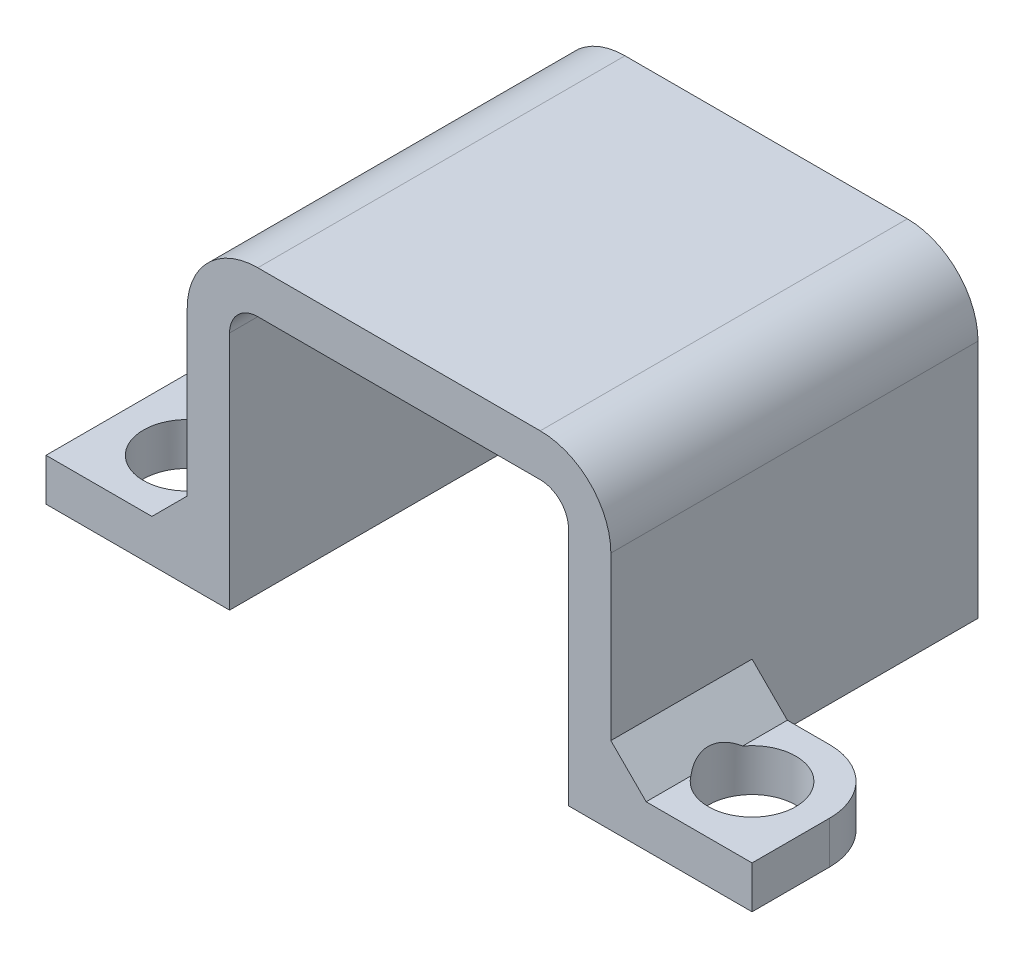
ISO-10303-21;
HEADER;
FILE_DESCRIPTION(('STEP AP214'),'2;1');
FILE_NAME('part.step','',(''),(''),'','','');
FILE_SCHEMA(('AUTOMOTIVE_DESIGN { 1 0 10303 214 1 1 1 1 }'));
ENDSEC;
DATA;
#1=APPLICATION_CONTEXT('core data for automotive mechanical design processes');
#2=APPLICATION_PROTOCOL_DEFINITION('international standard','automotive_design',2000,#1);
#3=PRODUCT_CONTEXT('',#1,'mechanical');
#4=PRODUCT('Part','Part','',(#3));
#5=PRODUCT_RELATED_PRODUCT_CATEGORY('part','',(#4));
#6=PRODUCT_DEFINITION_FORMATION('','',#4);
#7=PRODUCT_DEFINITION_CONTEXT('part definition',#1,'design');
#8=PRODUCT_DEFINITION('design','',#6,#7);
#9=PRODUCT_DEFINITION_SHAPE('','',#8);
#10=(LENGTH_UNIT() NAMED_UNIT(*) SI_UNIT(.MILLI.,.METRE.));
#11=(NAMED_UNIT(*) PLANE_ANGLE_UNIT() SI_UNIT($,.RADIAN.));
#12=(NAMED_UNIT(*) SI_UNIT($,.STERADIAN.) SOLID_ANGLE_UNIT());
#13=UNCERTAINTY_MEASURE_WITH_UNIT(LENGTH_MEASURE(1.E-05),#10,'distance_accuracy_value','');
#14=(GEOMETRIC_REPRESENTATION_CONTEXT(3) GLOBAL_UNCERTAINTY_ASSIGNED_CONTEXT((#13)) GLOBAL_UNIT_ASSIGNED_CONTEXT((#10,
#11,#12)) REPRESENTATION_CONTEXT('',''));
#15=CARTESIAN_POINT('',(0.,0.,0.));
#16=DIRECTION('',(0.,0.,1.));
#17=DIRECTION('',(1.,0.,0.));
#18=AXIS2_PLACEMENT_3D('',#15,#16,#17);
#19=CARTESIAN_POINT('',(-12.5,-8.,-13.));
#20=DIRECTION('',(0.,-1.,0.));
#21=DIRECTION('',(0.,0.,1.));
#22=AXIS2_PLACEMENT_3D('',#19,#20,#21);
#23=PLANE('',#22);
#24=CARTESIAN_POINT('',(-7.56801948466053,-8.,-10.75));
#25=DIRECTION('',(0.,1.,0.));
#26=DIRECTION('',(0.,0.,1.));
#27=AXIS2_PLACEMENT_3D('',#24,#25,#26);
#28=CIRCLE('',#27,2.25);
#29=CARTESIAN_POINT('',(-9.15900974233026,-8.,-12.3409902576697));
#30=VERTEX_POINT('',#29);
#31=CARTESIAN_POINT('',(-8.75000000000001,-8.,-12.6645292009676));
#32=VERTEX_POINT('',#31);
#33=EDGE_CURVE('E358',#30,#32,#28,.F.);
#34=ORIENTED_EDGE('',*,*,#33,.F.);
#35=DIRECTION('',(0.707106781186546,0.,-0.707106781186549));
#36=VECTOR('',#35,1.);
#37=CARTESIAN_POINT('',(-8.5,-8.,-13.));
#38=LINE('',#37,#36);
#39=CARTESIAN_POINT('',(-11.8409902576697,-8.,-9.65900974233025));
#40=VERTEX_POINT('',#39);
#41=EDGE_CURVE('E353',#40,#30,#38,.T.);
#42=ORIENTED_EDGE('',*,*,#41,.F.);
#43=CARTESIAN_POINT('',(-10.25,-8.,-8.06801948466052));
#44=DIRECTION('',(0.,1.,0.));
#45=DIRECTION('',(0.,0.,1.));
#46=AXIS2_PLACEMENT_3D('',#43,#44,#45);
#47=CIRCLE('',#46,2.25);
#48=CARTESIAN_POINT('',(-12.5,-8.,-8.06801948466052));
#49=VERTEX_POINT('',#48);
#50=EDGE_CURVE('E360',#49,#40,#47,.F.);
#51=ORIENTED_EDGE('',*,*,#50,.F.);
#52=DIRECTION('',(0.,0.,1.));
#53=VECTOR('',#52,1.);
#54=CARTESIAN_POINT('',(-12.5,-8.,-13.));
#55=LINE('',#54,#53);
#56=CARTESIAN_POINT('',(-12.5,-8.,0.));
#57=VERTEX_POINT('',#56);
#58=EDGE_CURVE('E307',#49,#57,#55,.T.);
#59=ORIENTED_EDGE('',*,*,#58,.T.);
#60=DIRECTION('',(-1.,0.,0.));
#61=VECTOR('',#60,1.);
#62=CARTESIAN_POINT('',(-12.5,-8.,0.));
#63=LINE('',#62,#61);
#64=CARTESIAN_POINT('',(-8.75000000000001,-8.,0.));
#65=VERTEX_POINT('',#64);
#66=EDGE_CURVE('E215',#65,#57,#63,.T.);
#67=ORIENTED_EDGE('',*,*,#66,.F.);
#68=DIRECTION('',(0.,0.,1.));
#69=VECTOR('',#68,1.);
#70=CARTESIAN_POINT('',(-8.75000000000001,-8.,0.));
#71=LINE('',#70,#69);
#72=CARTESIAN_POINT('',(-8.75000000000001,-8.,-1.58348486100882));
#73=VERTEX_POINT('',#72);
#74=EDGE_CURVE('E381',#73,#65,#71,.T.);
#75=ORIENTED_EDGE('',*,*,#74,.F.);
#76=CARTESIAN_POINT('',(-10.,-8.,-2.5));
#77=DIRECTION('',(0.,-1.,0.));
#78=DIRECTION('',(-1.,0.,0.));
#79=AXIS2_PLACEMENT_3D('',#76,#77,#78);
#80=CIRCLE('',#79,1.55);
#81=CARTESIAN_POINT('',(-8.75000000000001,-8.,-3.41651513899118));
#82=VERTEX_POINT('',#81);
#83=EDGE_CURVE('E535',#73,#82,#80,.T.);
#84=ORIENTED_EDGE('',*,*,#83,.T.);
#85=DIRECTION('',(0.,0.,1.));
#86=VECTOR('',#85,1.);
#87=CARTESIAN_POINT('',(-8.75000000000001,-8.,0.));
#88=LINE('',#87,#86);
#89=EDGE_CURVE('E384',#32,#82,#88,.T.);
#90=ORIENTED_EDGE('',*,*,#89,.F.);
#91=EDGE_LOOP('',(#34,#42,#51,#59,#67,#75,#84,#90));
#92=FACE_BOUND('',#91,.T.);
#93=ADVANCED_FACE('F37',(#92),#23,.F.);
#94=CARTESIAN_POINT('',(-12.5,-9.5,-13.));
#95=DIRECTION('',(1.,0.,0.));
#96=DIRECTION('',(0.,1.,0.));
#97=AXIS2_PLACEMENT_3D('',#94,#95,#96);
#98=PLANE('',#97);
#99=DIRECTION('',(0.,0.,1.));
#100=VECTOR('',#99,1.);
#101=CARTESIAN_POINT('',(-12.5,-9.5,-13.));
#102=LINE('',#101,#100);
#103=CARTESIAN_POINT('',(-12.5,-9.5,-8.06801948466052));
#104=VERTEX_POINT('',#103);
#105=CARTESIAN_POINT('',(-12.5,-9.5,0.));
#106=VERTEX_POINT('',#105);
#107=EDGE_CURVE('E304',#104,#106,#102,.T.);
#108=ORIENTED_EDGE('',*,*,#107,.T.);
#109=DIRECTION('',(0.,-1.,0.));
#110=VECTOR('',#109,1.);
#111=CARTESIAN_POINT('',(-12.5,-9.5,0.));
#112=LINE('',#111,#110);
#113=EDGE_CURVE('E262',#57,#106,#112,.T.);
#114=ORIENTED_EDGE('',*,*,#113,.F.);
#115=ORIENTED_EDGE('',*,*,#58,.F.);
#116=DIRECTION('',(0.,1.,0.));
#117=VECTOR('',#116,1.);
#118=CARTESIAN_POINT('',(-12.5,-8.,-8.06801948466052));
#119=LINE('',#118,#117);
#120=EDGE_CURVE('E356',#104,#49,#119,.T.);
#121=ORIENTED_EDGE('',*,*,#120,.F.);
#122=EDGE_LOOP('',(#108,#114,#115,#121));
#123=FACE_BOUND('',#122,.T.);
#124=ADVANCED_FACE('F460',(#123),#98,.F.);
#125=CARTESIAN_POINT('',(-6.,-9.5,-13.));
#126=DIRECTION('',(0.,1.,0.));
#127=DIRECTION('',(-1.,0.,0.));
#128=AXIS2_PLACEMENT_3D('',#125,#126,#127);
#129=PLANE('',#128);
#130=CARTESIAN_POINT('',(-10.,-9.50000000000001,-2.5));
#131=DIRECTION('',(0.,-1.,0.));
#132=DIRECTION('',(-1.,0.,0.));
#133=AXIS2_PLACEMENT_3D('',#130,#131,#132);
#134=CIRCLE('',#133,1.55);
#135=CARTESIAN_POINT('',(-11.55,-9.50000000000001,-2.5));
#136=VERTEX_POINT('',#135);
#137=EDGE_CURVE('E410',#136,#136,#134,.T.);
#138=ORIENTED_EDGE('',*,*,#137,.F.);
#139=EDGE_LOOP('',(#138));
#140=FACE_BOUND('',#139,.T.);
#141=DIRECTION('',(-0.707106781186546,0.,0.707106781186549));
#142=VECTOR('',#141,1.);
#143=CARTESIAN_POINT('',(-8.5,-9.5,-13.));
#144=LINE('',#143,#142);
#145=CARTESIAN_POINT('',(-9.15900974233026,-9.5,-12.3409902576697));
#146=VERTEX_POINT('',#145);
#147=CARTESIAN_POINT('',(-11.8409902576697,-9.5,-9.65900974233025));
#148=VERTEX_POINT('',#147);
#149=EDGE_CURVE('E350',#146,#148,#144,.T.);
#150=ORIENTED_EDGE('',*,*,#149,.F.);
#151=CARTESIAN_POINT('',(-7.56801948466053,-9.5,-10.75));
#152=DIRECTION('',(0.,-1.,0.));
#153=DIRECTION('',(-1.,0.,0.));
#154=AXIS2_PLACEMENT_3D('',#151,#152,#153);
#155=CIRCLE('',#154,2.25);
#156=CARTESIAN_POINT('',(-7.56801948466053,-9.5,-13.));
#157=VERTEX_POINT('',#156);
#158=EDGE_CURVE('E367',#157,#146,#155,.F.);
#159=ORIENTED_EDGE('',*,*,#158,.F.);
#160=DIRECTION('',(1.,0.,0.));
#161=VECTOR('',#160,1.);
#162=CARTESIAN_POINT('',(-6.,-9.5,-13.));
#163=LINE('',#162,#161);
#164=CARTESIAN_POINT('',(-6.,-9.5,-13.));
#165=VERTEX_POINT('',#164);
#166=EDGE_CURVE('E237',#157,#165,#163,.T.);
#167=ORIENTED_EDGE('',*,*,#166,.T.);
#168=DIRECTION('',(0.,0.,1.));
#169=VECTOR('',#168,1.);
#170=CARTESIAN_POINT('',(-6.,-9.5,-13.));
#171=LINE('',#170,#169);
#172=CARTESIAN_POINT('',(-6.,-9.5,0.));
#173=VERTEX_POINT('',#172);
#174=EDGE_CURVE('E301',#165,#173,#171,.T.);
#175=ORIENTED_EDGE('',*,*,#174,.T.);
#176=DIRECTION('',(1.,0.,0.));
#177=VECTOR('',#176,1.);
#178=CARTESIAN_POINT('',(-6.,-9.5,0.));
#179=LINE('',#178,#177);
#180=EDGE_CURVE('E265',#106,#173,#179,.T.);
#181=ORIENTED_EDGE('',*,*,#180,.F.);
#182=ORIENTED_EDGE('',*,*,#107,.F.);
#183=CARTESIAN_POINT('',(-10.25,-9.5,-8.06801948466052));
#184=DIRECTION('',(0.,-1.,0.));
#185=DIRECTION('',(-1.,0.,0.));
#186=AXIS2_PLACEMENT_3D('',#183,#184,#185);
#187=CIRCLE('',#186,2.25);
#188=EDGE_CURVE('E370',#148,#104,#187,.F.);
#189=ORIENTED_EDGE('',*,*,#188,.F.);
#190=EDGE_LOOP('',(#150,#159,#167,#175,#181,#182,#189));
#191=FACE_BOUND('',#190,.T.);
#192=ADVANCED_FACE('F465',(#140,#191),#129,.F.);
#193=CARTESIAN_POINT('',(-6.,0.,-13.));
#194=DIRECTION('',(-1.,0.,0.));
#195=DIRECTION('',(0.,-1.,0.));
#196=AXIS2_PLACEMENT_3D('',#193,#194,#195);
#197=PLANE('',#196);
#198=DIRECTION('',(0.,1.,0.));
#199=VECTOR('',#198,1.);
#200=CARTESIAN_POINT('',(-6.,0.,0.));
#201=LINE('',#200,#199);
#202=CARTESIAN_POINT('',(-6.,-1.,0.));
#203=VERTEX_POINT('',#202);
#204=EDGE_CURVE('E268',#173,#203,#201,.T.);
#205=ORIENTED_EDGE('',*,*,#204,.F.);
#206=ORIENTED_EDGE('',*,*,#174,.F.);
#207=DIRECTION('',(0.,1.,0.));
#208=VECTOR('',#207,1.);
#209=CARTESIAN_POINT('',(-6.,0.,-13.));
#210=LINE('',#209,#208);
#211=CARTESIAN_POINT('',(-6.,-1.,-13.));
#212=VERTEX_POINT('',#211);
#213=EDGE_CURVE('E240',#165,#212,#210,.T.);
#214=ORIENTED_EDGE('',*,*,#213,.T.);
#215=DIRECTION('',(0.,0.,1.));
#216=VECTOR('',#215,1.);
#217=CARTESIAN_POINT('',(-6.,-1.,-13.));
#218=LINE('',#217,#216);
#219=EDGE_CURVE('E316',#203,#212,#218,.F.);
#220=ORIENTED_EDGE('',*,*,#219,.F.);
#221=EDGE_LOOP('',(#205,#206,#214,#220));
#222=FACE_BOUND('',#221,.T.);
#223=ADVANCED_FACE('F469',(#222),#197,.F.);
#224=CARTESIAN_POINT('',(6.,0.,-13.));
#225=DIRECTION('',(0.,1.,0.));
#226=DIRECTION('',(-1.,0.,0.));
#227=AXIS2_PLACEMENT_3D('',#224,#225,#226);
#228=PLANE('',#227);
#229=DIRECTION('',(1.,0.,0.));
#230=VECTOR('',#229,1.);
#231=CARTESIAN_POINT('',(6.,0.,-13.));
#232=LINE('',#231,#230);
#233=CARTESIAN_POINT('',(-5.,0.,-13.));
#234=VERTEX_POINT('',#233);
#235=CARTESIAN_POINT('',(5.,0.,-13.));
#236=VERTEX_POINT('',#235);
#237=EDGE_CURVE('E244',#234,#236,#232,.T.);
#238=ORIENTED_EDGE('',*,*,#237,.T.);
#239=DIRECTION('',(0.,0.,1.));
#240=VECTOR('',#239,1.);
#241=CARTESIAN_POINT('',(5.,0.,-13.));
#242=LINE('',#241,#240);
#243=CARTESIAN_POINT('',(5.,0.,0.));
#244=VERTEX_POINT('',#243);
#245=EDGE_CURVE('E310',#244,#236,#242,.F.);
#246=ORIENTED_EDGE('',*,*,#245,.F.);
#247=DIRECTION('',(1.,0.,0.));
#248=VECTOR('',#247,1.);
#249=CARTESIAN_POINT('',(6.,0.,0.));
#250=LINE('',#249,#248);
#251=CARTESIAN_POINT('',(-5.,0.,0.));
#252=VERTEX_POINT('',#251);
#253=EDGE_CURVE('E271',#252,#244,#250,.T.);
#254=ORIENTED_EDGE('',*,*,#253,.F.);
#255=DIRECTION('',(0.,0.,1.));
#256=VECTOR('',#255,1.);
#257=CARTESIAN_POINT('',(-5.,0.,0.));
#258=LINE('',#257,#256);
#259=EDGE_CURVE('E313',#234,#252,#258,.T.);
#260=ORIENTED_EDGE('',*,*,#259,.F.);
#261=EDGE_LOOP('',(#238,#246,#254,#260));
#262=FACE_BOUND('',#261,.T.);
#263=ADVANCED_FACE('F476',(#262),#228,.F.);
#264=CARTESIAN_POINT('',(6.,0.,-13.));
#265=DIRECTION('',(1.,0.,0.));
#266=DIRECTION('',(0.,1.,0.));
#267=AXIS2_PLACEMENT_3D('',#264,#265,#266);
#268=PLANE('',#267);
#269=DIRECTION('',(0.,-1.,0.));
#270=VECTOR('',#269,1.);
#271=CARTESIAN_POINT('',(6.,0.,-13.));
#272=LINE('',#271,#270);
#273=CARTESIAN_POINT('',(6.,-0.999999999999999,-13.));
#274=VERTEX_POINT('',#273);
#275=CARTESIAN_POINT('',(6.,-9.5,-13.));
#276=VERTEX_POINT('',#275);
#277=EDGE_CURVE('E247',#274,#276,#272,.T.);
#278=ORIENTED_EDGE('',*,*,#277,.T.);
#279=DIRECTION('',(0.,0.,1.));
#280=VECTOR('',#279,1.);
#281=CARTESIAN_POINT('',(6.,-9.5,-13.));
#282=LINE('',#281,#280);
#283=CARTESIAN_POINT('',(6.,-9.5,0.));
#284=VERTEX_POINT('',#283);
#285=EDGE_CURVE('E298',#276,#284,#282,.T.);
#286=ORIENTED_EDGE('',*,*,#285,.T.);
#287=DIRECTION('',(0.,-1.,0.));
#288=VECTOR('',#287,1.);
#289=CARTESIAN_POINT('',(6.,0.,0.));
#290=LINE('',#289,#288);
#291=CARTESIAN_POINT('',(6.,-0.999999999999999,0.));
#292=VERTEX_POINT('',#291);
#293=EDGE_CURVE('E274',#292,#284,#290,.T.);
#294=ORIENTED_EDGE('',*,*,#293,.F.);
#295=DIRECTION('',(0.,0.,1.));
#296=VECTOR('',#295,1.);
#297=CARTESIAN_POINT('',(6.,-0.999999999999999,0.));
#298=LINE('',#297,#296);
#299=EDGE_CURVE('E319',#274,#292,#298,.T.);
#300=ORIENTED_EDGE('',*,*,#299,.F.);
#301=EDGE_LOOP('',(#278,#286,#294,#300));
#302=FACE_BOUND('',#301,.T.);
#303=ADVANCED_FACE('F427',(#302),#268,.F.);
#304=CARTESIAN_POINT('',(6.,-9.5,-13.));
#305=DIRECTION('',(0.,1.,0.));
#306=DIRECTION('',(0.,0.,-1.));
#307=AXIS2_PLACEMENT_3D('',#304,#305,#306);
#308=PLANE('',#307);
#309=CARTESIAN_POINT('',(10.,-9.5,-2.5));
#310=DIRECTION('',(0.,-1.,0.));
#311=DIRECTION('',(-1.,0.,0.));
#312=AXIS2_PLACEMENT_3D('',#309,#310,#311);
#313=CIRCLE('',#312,1.55);
#314=CARTESIAN_POINT('',(8.45,-9.5,-2.5));
#315=VERTEX_POINT('',#314);
#316=EDGE_CURVE('E235',#315,#315,#313,.T.);
#317=ORIENTED_EDGE('',*,*,#316,.F.);
#318=EDGE_LOOP('',(#317));
#319=FACE_BOUND('',#318,.T.);
#320=DIRECTION('',(0.,0.,1.));
#321=VECTOR('',#320,1.);
#322=CARTESIAN_POINT('',(12.5,-9.5,-13.));
#323=LINE('',#322,#321);
#324=CARTESIAN_POINT('',(12.5,-9.5,-2.75));
#325=VERTEX_POINT('',#324);
#326=CARTESIAN_POINT('',(12.5,-9.5,0.));
#327=VERTEX_POINT('',#326);
#328=EDGE_CURVE('E296',#325,#327,#323,.T.);
#329=ORIENTED_EDGE('',*,*,#328,.T.);
#330=DIRECTION('',(1.,0.,0.));
#331=VECTOR('',#330,1.);
#332=CARTESIAN_POINT('',(6.,-9.5,0.));
#333=LINE('',#332,#331);
#334=EDGE_CURVE('E277',#284,#327,#333,.T.);
#335=ORIENTED_EDGE('',*,*,#334,.F.);
#336=ORIENTED_EDGE('',*,*,#285,.F.);
#337=DIRECTION('',(1.,0.,0.));
#338=VECTOR('',#337,1.);
#339=CARTESIAN_POINT('',(6.,-9.5,-13.));
#340=LINE('',#339,#338);
#341=CARTESIAN_POINT('',(7.5,-9.5,-13.));
#342=VERTEX_POINT('',#341);
#343=EDGE_CURVE('E230',#276,#342,#340,.T.);
#344=ORIENTED_EDGE('',*,*,#343,.T.);
#345=DIRECTION('',(0.,0.,-1.));
#346=VECTOR('',#345,1.);
#347=CARTESIAN_POINT('',(7.5,-9.5,-13.));
#348=LINE('',#347,#346);
#349=CARTESIAN_POINT('',(7.5,-9.5,-5.));
#350=VERTEX_POINT('',#349);
#351=EDGE_CURVE('E210',#350,#342,#348,.T.);
#352=ORIENTED_EDGE('',*,*,#351,.F.);
#353=DIRECTION('',(-1.,0.,0.));
#354=VECTOR('',#353,1.);
#355=CARTESIAN_POINT('',(12.5,-9.5,-5.));
#356=LINE('',#355,#354);
#357=CARTESIAN_POINT('',(10.25,-9.5,-5.));
#358=VERTEX_POINT('',#357);
#359=EDGE_CURVE('E218',#358,#350,#356,.T.);
#360=ORIENTED_EDGE('',*,*,#359,.F.);
#361=CARTESIAN_POINT('',(10.25,-9.5,-2.75));
#362=DIRECTION('',(0.,-1.,0.));
#363=DIRECTION('',(0.,0.,-1.));
#364=AXIS2_PLACEMENT_3D('',#361,#362,#363);
#365=CIRCLE('',#364,2.25);
#366=EDGE_CURVE('E379',#325,#358,#365,.F.);
#367=ORIENTED_EDGE('',*,*,#366,.F.);
#368=EDGE_LOOP('',(#329,#335,#336,#344,#352,#360,#367));
#369=FACE_BOUND('',#368,.T.);
#370=ADVANCED_FACE('F228',(#319,#369),#308,.F.);
#371=CARTESIAN_POINT('',(12.5,-9.5,-13.));
#372=DIRECTION('',(-1.,0.,0.));
#373=DIRECTION('',(0.,-1.,0.));
#374=AXIS2_PLACEMENT_3D('',#371,#372,#373);
#375=PLANE('',#374);
#376=DIRECTION('',(0.,0.,1.));
#377=VECTOR('',#376,1.);
#378=CARTESIAN_POINT('',(12.5,-8.,-13.));
#379=LINE('',#378,#377);
#380=CARTESIAN_POINT('',(12.5,-8.,-2.75));
#381=VERTEX_POINT('',#380);
#382=CARTESIAN_POINT('',(12.5,-8.,0.));
#383=VERTEX_POINT('',#382);
#384=EDGE_CURVE('E259',#381,#383,#379,.T.);
#385=ORIENTED_EDGE('',*,*,#384,.T.);
#386=DIRECTION('',(0.,1.,0.));
#387=VECTOR('',#386,1.);
#388=CARTESIAN_POINT('',(12.5,-9.5,0.));
#389=LINE('',#388,#387);
#390=EDGE_CURVE('E280',#327,#383,#389,.T.);
#391=ORIENTED_EDGE('',*,*,#390,.F.);
#392=ORIENTED_EDGE('',*,*,#328,.F.);
#393=DIRECTION('',(0.,1.,0.));
#394=VECTOR('',#393,1.);
#395=CARTESIAN_POINT('',(12.5,-9.5,-2.75));
#396=LINE('',#395,#394);
#397=EDGE_CURVE('E377',#381,#325,#396,.F.);
#398=ORIENTED_EDGE('',*,*,#397,.F.);
#399=EDGE_LOOP('',(#385,#391,#392,#398));
#400=FACE_BOUND('',#399,.T.);
#401=ADVANCED_FACE('F420',(#400),#375,.F.);
#402=CARTESIAN_POINT('',(12.5,-8.,-13.));
#403=DIRECTION('',(0.,-1.,0.));
#404=DIRECTION('',(1.,0.,0.));
#405=AXIS2_PLACEMENT_3D('',#402,#403,#404);
#406=PLANE('',#405);
#407=DIRECTION('',(-1.,0.,0.));
#408=VECTOR('',#407,1.);
#409=CARTESIAN_POINT('',(12.5,-8.,0.));
#410=LINE('',#409,#408);
#411=CARTESIAN_POINT('',(8.75000000000001,-8.,0.));
#412=VERTEX_POINT('',#411);
#413=EDGE_CURVE('E283',#383,#412,#410,.T.);
#414=ORIENTED_EDGE('',*,*,#413,.F.);
#415=ORIENTED_EDGE('',*,*,#384,.F.);
#416=CARTESIAN_POINT('',(10.25,-8.,-2.75));
#417=DIRECTION('',(0.,1.,0.));
#418=DIRECTION('',(1.,0.,0.));
#419=AXIS2_PLACEMENT_3D('',#416,#417,#418);
#420=CIRCLE('',#419,2.25);
#421=CARTESIAN_POINT('',(10.25,-8.,-5.));
#422=VERTEX_POINT('',#421);
#423=EDGE_CURVE('E375',#422,#381,#420,.F.);
#424=ORIENTED_EDGE('',*,*,#423,.F.);
#425=DIRECTION('',(-1.,0.,0.));
#426=VECTOR('',#425,1.);
#427=CARTESIAN_POINT('',(12.5,-8.,-5.));
#428=LINE('',#427,#426);
#429=CARTESIAN_POINT('',(8.75000000000001,-8.,-5.));
#430=VERTEX_POINT('',#429);
#431=EDGE_CURVE('E225',#422,#430,#428,.T.);
#432=ORIENTED_EDGE('',*,*,#431,.T.);
#433=DIRECTION('',(0.,0.,-1.));
#434=VECTOR('',#433,1.);
#435=CARTESIAN_POINT('',(8.75000000000001,-8.,-5.));
#436=LINE('',#435,#434);
#437=CARTESIAN_POINT('',(8.75000000000001,-8.,-3.41651513899118));
#438=VERTEX_POINT('',#437);
#439=EDGE_CURVE('E391',#438,#430,#436,.T.);
#440=ORIENTED_EDGE('',*,*,#439,.F.);
#441=CARTESIAN_POINT('',(10.,-8.,-2.5));
#442=DIRECTION('',(0.,-1.,0.));
#443=DIRECTION('',(-1.,0.,0.));
#444=AXIS2_PLACEMENT_3D('',#441,#442,#443);
#445=CIRCLE('',#444,1.55);
#446=CARTESIAN_POINT('',(8.75000000000001,-8.,-1.58348486100882));
#447=VERTEX_POINT('',#446);
#448=EDGE_CURVE('E407',#438,#447,#445,.T.);
#449=ORIENTED_EDGE('',*,*,#448,.T.);
#450=DIRECTION('',(0.,0.,-1.));
#451=VECTOR('',#450,1.);
#452=CARTESIAN_POINT('',(8.75000000000001,-8.,-5.));
#453=LINE('',#452,#451);
#454=EDGE_CURVE('E394',#412,#447,#453,.T.);
#455=ORIENTED_EDGE('',*,*,#454,.F.);
#456=EDGE_LOOP('',(#414,#415,#424,#432,#440,#449,#455));
#457=FACE_BOUND('',#456,.T.);
#458=ADVANCED_FACE('F412',(#457),#406,.F.);
#459=CARTESIAN_POINT('',(7.5,-8.,-13.));
#460=DIRECTION('',(-1.,0.,0.));
#461=DIRECTION('',(0.,-1.,0.));
#462=AXIS2_PLACEMENT_3D('',#459,#460,#461);
#463=PLANE('',#462);
#464=DIRECTION('',(0.,1.,0.));
#465=VECTOR('',#464,1.);
#466=CARTESIAN_POINT('',(7.5,-9.5,-5.));
#467=LINE('',#466,#465);
#468=CARTESIAN_POINT('',(7.5,-6.74999999999998,-5.));
#469=VERTEX_POINT('',#468);
#470=EDGE_CURVE('E205',#350,#469,#467,.T.);
#471=ORIENTED_EDGE('',*,*,#470,.F.);
#472=ORIENTED_EDGE('',*,*,#351,.T.);
#473=DIRECTION('',(0.,1.,0.));
#474=VECTOR('',#473,1.);
#475=CARTESIAN_POINT('',(7.5,-8.,-13.));
#476=LINE('',#475,#474);
#477=CARTESIAN_POINT('',(7.5,-0.999999999999998,-13.));
#478=VERTEX_POINT('',#477);
#479=EDGE_CURVE('E251',#342,#478,#476,.T.);
#480=ORIENTED_EDGE('',*,*,#479,.T.);
#481=DIRECTION('',(0.,0.,1.));
#482=VECTOR('',#481,1.);
#483=CARTESIAN_POINT('',(7.5,-0.999999999999998,-13.));
#484=LINE('',#483,#482);
#485=CARTESIAN_POINT('',(7.5,-0.999999999999998,0.));
#486=VERTEX_POINT('',#485);
#487=EDGE_CURVE('E347',#486,#478,#484,.F.);
#488=ORIENTED_EDGE('',*,*,#487,.F.);
#489=DIRECTION('',(0.,1.,0.));
#490=VECTOR('',#489,1.);
#491=CARTESIAN_POINT('',(7.5,-8.,0.));
#492=LINE('',#491,#490);
#493=CARTESIAN_POINT('',(7.5,-6.74999999999998,0.));
#494=VERTEX_POINT('',#493);
#495=EDGE_CURVE('E286',#494,#486,#492,.T.);
#496=ORIENTED_EDGE('',*,*,#495,.F.);
#497=DIRECTION('',(0.,0.,1.));
#498=VECTOR('',#497,1.);
#499=CARTESIAN_POINT('',(7.5,-6.74999999999998,0.));
#500=LINE('',#499,#498);
#501=EDGE_CURVE('E213',#469,#494,#500,.T.);
#502=ORIENTED_EDGE('',*,*,#501,.F.);
#503=EDGE_LOOP('',(#471,#472,#480,#488,#496,#502));
#504=FACE_BOUND('',#503,.T.);
#505=ADVANCED_FACE('F207',(#504),#463,.F.);
#506=CARTESIAN_POINT('',(-7.5,1.5,-13.));
#507=DIRECTION('',(0.,-1.,0.));
#508=DIRECTION('',(1.,0.,0.));
#509=AXIS2_PLACEMENT_3D('',#506,#507,#508);
#510=PLANE('',#509);
#511=DIRECTION('',(-1.,0.,0.));
#512=VECTOR('',#511,1.);
#513=CARTESIAN_POINT('',(-7.5,1.5,0.));
#514=LINE('',#513,#512);
#515=CARTESIAN_POINT('',(5.,1.5,0.));
#516=VERTEX_POINT('',#515);
#517=CARTESIAN_POINT('',(-5.,1.5,0.));
#518=VERTEX_POINT('',#517);
#519=EDGE_CURVE('E289',#516,#518,#514,.T.);
#520=ORIENTED_EDGE('',*,*,#519,.F.);
#521=DIRECTION('',(0.,0.,1.));
#522=VECTOR('',#521,1.);
#523=CARTESIAN_POINT('',(5.,1.5,-13.));
#524=LINE('',#523,#522);
#525=CARTESIAN_POINT('',(5.,1.5,-13.));
#526=VERTEX_POINT('',#525);
#527=EDGE_CURVE('E337',#526,#516,#524,.T.);
#528=ORIENTED_EDGE('',*,*,#527,.F.);
#529=DIRECTION('',(-1.,0.,0.));
#530=VECTOR('',#529,1.);
#531=CARTESIAN_POINT('',(-7.5,1.5,-13.));
#532=LINE('',#531,#530);
#533=CARTESIAN_POINT('',(-5.,1.5,-13.));
#534=VERTEX_POINT('',#533);
#535=EDGE_CURVE('E253',#526,#534,#532,.T.);
#536=ORIENTED_EDGE('',*,*,#535,.T.);
#537=DIRECTION('',(0.,0.,1.));
#538=VECTOR('',#537,1.);
#539=CARTESIAN_POINT('',(-5.,1.5,-13.));
#540=LINE('',#539,#538);
#541=EDGE_CURVE('E340',#518,#534,#540,.F.);
#542=ORIENTED_EDGE('',*,*,#541,.F.);
#543=EDGE_LOOP('',(#520,#528,#536,#542));
#544=FACE_BOUND('',#543,.T.);
#545=ADVANCED_FACE('F440',(#544),#510,.F.);
#546=CARTESIAN_POINT('',(-7.5,-8.,-13.));
#547=DIRECTION('',(1.,0.,0.));
#548=DIRECTION('',(0.,1.,0.));
#549=AXIS2_PLACEMENT_3D('',#546,#547,#548);
#550=PLANE('',#549);
#551=DIRECTION('',(0.,-1.,0.));
#552=VECTOR('',#551,1.);
#553=CARTESIAN_POINT('',(-7.5,-8.,0.));
#554=LINE('',#553,#552);
#555=CARTESIAN_POINT('',(-7.5,-1.,0.));
#556=VERTEX_POINT('',#555);
#557=CARTESIAN_POINT('',(-7.5,-6.75000000000001,0.));
#558=VERTEX_POINT('',#557);
#559=EDGE_CURVE('E241',#556,#558,#554,.T.);
#560=ORIENTED_EDGE('',*,*,#559,.F.);
#561=DIRECTION('',(0.,0.,1.));
#562=VECTOR('',#561,1.);
#563=CARTESIAN_POINT('',(-7.5,-1.,-13.));
#564=LINE('',#563,#562);
#565=CARTESIAN_POINT('',(-7.5,-1.,-13.));
#566=VERTEX_POINT('',#565);
#567=EDGE_CURVE('E330',#566,#556,#564,.T.);
#568=ORIENTED_EDGE('',*,*,#567,.F.);
#569=DIRECTION('',(0.,-1.,0.));
#570=VECTOR('',#569,1.);
#571=CARTESIAN_POINT('',(-7.5,-8.,-13.));
#572=LINE('',#571,#570);
#573=CARTESIAN_POINT('',(-7.5,-6.75000000000001,-13.));
#574=VERTEX_POINT('',#573);
#575=EDGE_CURVE('E256',#566,#574,#572,.T.);
#576=ORIENTED_EDGE('',*,*,#575,.T.);
#577=DIRECTION('',(0.,0.,-1.));
#578=VECTOR('',#577,1.);
#579=CARTESIAN_POINT('',(-7.5,-6.75000000000001,-13.));
#580=LINE('',#579,#578);
#581=EDGE_CURVE('E387',#558,#574,#580,.T.);
#582=ORIENTED_EDGE('',*,*,#581,.F.);
#583=EDGE_LOOP('',(#560,#568,#576,#582));
#584=FACE_BOUND('',#583,.T.);
#585=ADVANCED_FACE('F447',(#584),#550,.F.);
#586=CARTESIAN_POINT('',(0.,0.,-13.));
#587=DIRECTION('',(0.,0.,-1.));
#588=DIRECTION('',(1.,0.,0.));
#589=AXIS2_PLACEMENT_3D('',#586,#587,#588);
#590=PLANE('',#589);
#591=ORIENTED_EDGE('',*,*,#575,.F.);
#592=CARTESIAN_POINT('',(-5.,-1.,-13.));
#593=DIRECTION('',(0.,0.,1.));
#594=DIRECTION('',(1.,0.,0.));
#595=AXIS2_PLACEMENT_3D('',#592,#593,#594);
#596=CIRCLE('',#595,2.5);
#597=EDGE_CURVE('E345',#534,#566,#596,.T.);
#598=ORIENTED_EDGE('',*,*,#597,.F.);
#599=ORIENTED_EDGE('',*,*,#535,.F.);
#600=CARTESIAN_POINT('',(5.,-0.999999999999999,-13.));
#601=DIRECTION('',(0.,0.,1.));
#602=DIRECTION('',(1.,0.,0.));
#603=AXIS2_PLACEMENT_3D('',#600,#601,#602);
#604=CIRCLE('',#603,2.5);
#605=EDGE_CURVE('E343',#478,#526,#604,.T.);
#606=ORIENTED_EDGE('',*,*,#605,.F.);
#607=ORIENTED_EDGE('',*,*,#479,.F.);
#608=ORIENTED_EDGE('',*,*,#343,.F.);
#609=ORIENTED_EDGE('',*,*,#277,.F.);
#610=CARTESIAN_POINT('',(5.,-0.999999999999999,-13.));
#611=DIRECTION('',(0.,0.,1.));
#612=DIRECTION('',(1.,0.,0.));
#613=AXIS2_PLACEMENT_3D('',#610,#611,#612);
#614=CIRCLE('',#613,1.);
#615=EDGE_CURVE('E328',#236,#274,#614,.F.);
#616=ORIENTED_EDGE('',*,*,#615,.F.);
#617=ORIENTED_EDGE('',*,*,#237,.F.);
#618=CARTESIAN_POINT('',(-5.,-1.,-13.));
#619=DIRECTION('',(0.,0.,1.));
#620=DIRECTION('',(1.,0.,0.));
#621=AXIS2_PLACEMENT_3D('',#618,#619,#620);
#622=CIRCLE('',#621,1.);
#623=EDGE_CURVE('E324',#212,#234,#622,.F.);
#624=ORIENTED_EDGE('',*,*,#623,.F.);
#625=ORIENTED_EDGE('',*,*,#213,.F.);
#626=ORIENTED_EDGE('',*,*,#166,.F.);
#627=DIRECTION('',(0.,-1.,0.));
#628=VECTOR('',#627,1.);
#629=CARTESIAN_POINT('',(-7.56801948466054,0.,-13.));
#630=LINE('',#629,#628);
#631=CARTESIAN_POINT('',(-7.56801948466053,-6.81801948466054,-13.));
#632=VERTEX_POINT('',#631);
#633=EDGE_CURVE('E372',#632,#157,#630,.T.);
#634=ORIENTED_EDGE('',*,*,#633,.F.);
#635=DIRECTION('',(0.707106781186551,0.707106781186544,0.));
#636=VECTOR('',#635,1.);
#637=CARTESIAN_POINT('',(-8.75000000000001,-8.,-13.));
#638=LINE('',#637,#636);
#639=EDGE_CURVE('E400',#574,#632,#638,.F.);
#640=ORIENTED_EDGE('',*,*,#639,.F.);
#641=EDGE_LOOP('',(#591,#598,#599,#606,#607,#608,#609,#616,#617,#624,#625,#626,#634,#640));
#642=FACE_BOUND('',#641,.T.);
#643=ADVANCED_FACE('F431',(#642),#590,.T.);
#644=CARTESIAN_POINT('',(0.,0.,0.));
#645=DIRECTION('',(0.,0.,-1.));
#646=DIRECTION('',(1.,0.,0.));
#647=AXIS2_PLACEMENT_3D('',#644,#645,#646);
#648=PLANE('',#647);
#649=ORIENTED_EDGE('',*,*,#559,.T.);
#650=DIRECTION('',(-0.707106781186551,-0.707106781186544,0.));
#651=VECTOR('',#650,1.);
#652=CARTESIAN_POINT('',(-0.374999999999957,0.374999999999961,0.));
#653=LINE('',#652,#651);
#654=EDGE_CURVE('E398',#65,#558,#653,.F.);
#655=ORIENTED_EDGE('',*,*,#654,.F.);
#656=ORIENTED_EDGE('',*,*,#66,.T.);
#657=ORIENTED_EDGE('',*,*,#113,.T.);
#658=ORIENTED_EDGE('',*,*,#180,.T.);
#659=ORIENTED_EDGE('',*,*,#204,.T.);
#660=CARTESIAN_POINT('',(-5.,-1.,0.));
#661=DIRECTION('',(0.,0.,1.));
#662=DIRECTION('',(1.,0.,0.));
#663=AXIS2_PLACEMENT_3D('',#660,#661,#662);
#664=CIRCLE('',#663,1.);
#665=EDGE_CURVE('E322',#252,#203,#664,.T.);
#666=ORIENTED_EDGE('',*,*,#665,.F.);
#667=ORIENTED_EDGE('',*,*,#253,.T.);
#668=CARTESIAN_POINT('',(5.,-0.999999999999999,0.));
#669=DIRECTION('',(0.,0.,1.));
#670=DIRECTION('',(1.,0.,0.));
#671=AXIS2_PLACEMENT_3D('',#668,#669,#670);
#672=CIRCLE('',#671,1.);
#673=EDGE_CURVE('E326',#292,#244,#672,.T.);
#674=ORIENTED_EDGE('',*,*,#673,.F.);
#675=ORIENTED_EDGE('',*,*,#293,.T.);
#676=ORIENTED_EDGE('',*,*,#334,.T.);
#677=ORIENTED_EDGE('',*,*,#390,.T.);
#678=ORIENTED_EDGE('',*,*,#413,.T.);
#679=DIRECTION('',(-0.707106781186544,0.707106781186551,0.));
#680=VECTOR('',#679,1.);
#681=CARTESIAN_POINT('',(0.375000000000054,0.375000000000049,0.));
#682=LINE('',#681,#680);
#683=EDGE_CURVE('E60',#494,#412,#682,.F.);
#684=ORIENTED_EDGE('',*,*,#683,.F.);
#685=ORIENTED_EDGE('',*,*,#495,.T.);
#686=CARTESIAN_POINT('',(5.,-0.999999999999999,0.));
#687=DIRECTION('',(0.,0.,1.));
#688=DIRECTION('',(1.,0.,0.));
#689=AXIS2_PLACEMENT_3D('',#686,#687,#688);
#690=CIRCLE('',#689,2.5);
#691=EDGE_CURVE('E333',#516,#486,#690,.F.);
#692=ORIENTED_EDGE('',*,*,#691,.F.);
#693=ORIENTED_EDGE('',*,*,#519,.T.);
#694=CARTESIAN_POINT('',(-5.,-1.,0.));
#695=DIRECTION('',(0.,0.,1.));
#696=DIRECTION('',(1.,0.,0.));
#697=AXIS2_PLACEMENT_3D('',#694,#695,#696);
#698=CIRCLE('',#697,2.5);
#699=EDGE_CURVE('E335',#556,#518,#698,.F.);
#700=ORIENTED_EDGE('',*,*,#699,.F.);
#701=EDGE_LOOP('',(#649,#655,#656,#657,#658,#659,#666,#667,#674,#675,#676,#677,#678,#684,#685,
#692,#693,#700));
#702=FACE_BOUND('',#701,.T.);
#703=ADVANCED_FACE('F417',(#702),#648,.F.);
#704=CARTESIAN_POINT('',(12.5,-9.5,-5.));
#705=DIRECTION('',(0.,0.,1.));
#706=DIRECTION('',(-1.,0.,0.));
#707=AXIS2_PLACEMENT_3D('',#704,#705,#706);
#708=PLANE('',#707);
#709=ORIENTED_EDGE('',*,*,#359,.T.);
#710=ORIENTED_EDGE('',*,*,#470,.T.);
#711=DIRECTION('',(0.707106781186544,-0.707106781186551,0.));
#712=VECTOR('',#711,1.);
#713=CARTESIAN_POINT('',(11.375,-10.625,-5.));
#714=LINE('',#713,#712);
#715=EDGE_CURVE('E11',#430,#469,#714,.F.);
#716=ORIENTED_EDGE('',*,*,#715,.F.);
#717=ORIENTED_EDGE('',*,*,#431,.F.);
#718=DIRECTION('',(0.,1.,0.));
#719=VECTOR('',#718,1.);
#720=CARTESIAN_POINT('',(10.25,-9.5,-5.));
#721=LINE('',#720,#719);
#722=EDGE_CURVE('E221',#358,#422,#721,.T.);
#723=ORIENTED_EDGE('',*,*,#722,.F.);
#724=EDGE_LOOP('',(#709,#710,#716,#717,#723));
#725=FACE_BOUND('',#724,.T.);
#726=ADVANCED_FACE('F219',(#725),#708,.F.);
#727=CARTESIAN_POINT('',(10.,-9.5,-2.5));
#728=DIRECTION('',(0.,1.,0.));
#729=DIRECTION('',(-1.,0.,0.));
#730=AXIS2_PLACEMENT_3D('',#727,#728,#729);
#731=CYLINDRICAL_SURFACE('',#730,1.55);
#732=ORIENTED_EDGE('',*,*,#316,.T.);
#733=EDGE_LOOP('',(#732));
#734=FACE_BOUND('',#733,.T.);
#735=ORIENTED_EDGE('',*,*,#448,.F.);
#736=CARTESIAN_POINT('',(10.,-9.25000000000001,-2.5));
#737=DIRECTION('',(-0.707106781186551,-0.707106781186544,0.));
#738=DIRECTION('',(-0.707106781186544,0.707106781186551,0.));
#739=AXIS2_PLACEMENT_3D('',#736,#737,#738);
#740=ELLIPSE('',#739,2.19203102167831,1.55);
#741=EDGE_CURVE('E45',#447,#438,#740,.T.);
#742=ORIENTED_EDGE('',*,*,#741,.F.);
#743=EDGE_LOOP('',(#735,#742));
#744=FACE_BOUND('',#743,.T.);
#745=ADVANCED_FACE('F408',(#734,#744),#731,.F.);
#746=CARTESIAN_POINT('',(-10.,-9.50000000000001,-2.5));
#747=DIRECTION('',(0.,1.,0.));
#748=DIRECTION('',(-1.,0.,0.));
#749=AXIS2_PLACEMENT_3D('',#746,#747,#748);
#750=CYLINDRICAL_SURFACE('',#749,1.55);
#751=ORIENTED_EDGE('',*,*,#137,.T.);
#752=EDGE_LOOP('',(#751));
#753=FACE_BOUND('',#752,.T.);
#754=ORIENTED_EDGE('',*,*,#83,.F.);
#755=CARTESIAN_POINT('',(-10.,-9.24999999999998,-2.5));
#756=DIRECTION('',(0.707106781186544,-0.707106781186551,0.));
#757=DIRECTION('',(0.707106781186551,0.707106781186544,0.));
#758=AXIS2_PLACEMENT_3D('',#755,#756,#757);
#759=ELLIPSE('',#758,2.19203102167829,1.55);
#760=EDGE_CURVE('E396',#82,#73,#759,.T.);
#761=ORIENTED_EDGE('',*,*,#760,.F.);
#762=EDGE_LOOP('',(#754,#761));
#763=FACE_BOUND('',#762,.T.);
#764=ADVANCED_FACE('F486',(#753,#763),#750,.F.);
#765=CARTESIAN_POINT('',(-5.,-1.,-13.));
#766=DIRECTION('',(0.,0.,-1.));
#767=DIRECTION('',(1.,0.,0.));
#768=AXIS2_PLACEMENT_3D('',#765,#766,#767);
#769=CYLINDRICAL_SURFACE('',#768,1.);
#770=ORIENTED_EDGE('',*,*,#623,.T.);
#771=ORIENTED_EDGE('',*,*,#259,.T.);
#772=ORIENTED_EDGE('',*,*,#665,.T.);
#773=ORIENTED_EDGE('',*,*,#219,.T.);
#774=EDGE_LOOP('',(#770,#771,#772,#773));
#775=FACE_BOUND('',#774,.T.);
#776=ADVANCED_FACE('F471',(#775),#769,.F.);
#777=CARTESIAN_POINT('',(5.,-0.999999999999999,-13.));
#778=DIRECTION('',(0.,0.,-1.));
#779=DIRECTION('',(1.,0.,0.));
#780=AXIS2_PLACEMENT_3D('',#777,#778,#779);
#781=CYLINDRICAL_SURFACE('',#780,1.);
#782=ORIENTED_EDGE('',*,*,#615,.T.);
#783=ORIENTED_EDGE('',*,*,#299,.T.);
#784=ORIENTED_EDGE('',*,*,#673,.T.);
#785=ORIENTED_EDGE('',*,*,#245,.T.);
#786=EDGE_LOOP('',(#782,#783,#784,#785));
#787=FACE_BOUND('',#786,.T.);
#788=ADVANCED_FACE('F478',(#787),#781,.F.);
#789=CARTESIAN_POINT('',(-5.,-1.,-13.));
#790=DIRECTION('',(0.,0.,1.));
#791=DIRECTION('',(-1.,0.,0.));
#792=AXIS2_PLACEMENT_3D('',#789,#790,#791);
#793=CYLINDRICAL_SURFACE('',#792,2.5);
#794=ORIENTED_EDGE('',*,*,#597,.T.);
#795=ORIENTED_EDGE('',*,*,#567,.T.);
#796=ORIENTED_EDGE('',*,*,#699,.T.);
#797=ORIENTED_EDGE('',*,*,#541,.T.);
#798=EDGE_LOOP('',(#794,#795,#796,#797));
#799=FACE_BOUND('',#798,.T.);
#800=ADVANCED_FACE('F444',(#799),#793,.T.);
#801=CARTESIAN_POINT('',(5.,-0.999999999999999,-13.));
#802=DIRECTION('',(0.,0.,1.));
#803=DIRECTION('',(-1.,0.,0.));
#804=AXIS2_PLACEMENT_3D('',#801,#802,#803);
#805=CYLINDRICAL_SURFACE('',#804,2.5);
#806=ORIENTED_EDGE('',*,*,#605,.T.);
#807=ORIENTED_EDGE('',*,*,#527,.T.);
#808=ORIENTED_EDGE('',*,*,#691,.T.);
#809=ORIENTED_EDGE('',*,*,#487,.T.);
#810=EDGE_LOOP('',(#806,#807,#808,#809));
#811=FACE_BOUND('',#810,.T.);
#812=ADVANCED_FACE('F436',(#811),#805,.T.);
#813=CARTESIAN_POINT('',(-8.5,0.,-13.));
#814=DIRECTION('',(-0.707106781186549,0.,-0.707106781186546));
#815=DIRECTION('',(0.,1.,0.));
#816=AXIS2_PLACEMENT_3D('',#813,#814,#815);
#817=PLANE('',#816);
#818=ORIENTED_EDGE('',*,*,#41,.T.);
#819=DIRECTION('',(0.,-1.,0.));
#820=VECTOR('',#819,1.);
#821=CARTESIAN_POINT('',(-9.15900974233027,0.,-12.3409902576697));
#822=LINE('',#821,#820);
#823=EDGE_CURVE('E363',#146,#30,#822,.F.);
#824=ORIENTED_EDGE('',*,*,#823,.F.);
#825=ORIENTED_EDGE('',*,*,#149,.T.);
#826=DIRECTION('',(0.,1.,0.));
#827=VECTOR('',#826,1.);
#828=CARTESIAN_POINT('',(-11.8409902576697,-9.5,-9.65900974233025));
#829=LINE('',#828,#827);
#830=EDGE_CURVE('E365',#40,#148,#829,.F.);
#831=ORIENTED_EDGE('',*,*,#830,.F.);
#832=EDGE_LOOP('',(#818,#824,#825,#831));
#833=FACE_BOUND('',#832,.T.);
#834=ADVANCED_FACE('F543',(#833),#817,.T.);
#835=CARTESIAN_POINT('',(-10.25,-9.5,-8.06801948466052));
#836=DIRECTION('',(0.,-1.,0.));
#837=DIRECTION('',(1.,0.,0.));
#838=AXIS2_PLACEMENT_3D('',#835,#836,#837);
#839=CYLINDRICAL_SURFACE('',#838,2.25);
#840=ORIENTED_EDGE('',*,*,#188,.T.);
#841=ORIENTED_EDGE('',*,*,#120,.T.);
#842=ORIENTED_EDGE('',*,*,#50,.T.);
#843=ORIENTED_EDGE('',*,*,#830,.T.);
#844=EDGE_LOOP('',(#840,#841,#842,#843));
#845=FACE_BOUND('',#844,.T.);
#846=ADVANCED_FACE('F545',(#845),#839,.T.);
#847=CARTESIAN_POINT('',(-7.56801948466054,0.,-10.75));
#848=DIRECTION('',(0.,-1.,0.));
#849=DIRECTION('',(1.,0.,0.));
#850=AXIS2_PLACEMENT_3D('',#847,#848,#849);
#851=CYLINDRICAL_SURFACE('',#850,2.25);
#852=ORIENTED_EDGE('',*,*,#33,.T.);
#853=CARTESIAN_POINT('',(-7.56801948466053,-6.81801948466054,-10.75));
#854=DIRECTION('',(0.707106781186544,-0.707106781186551,0.));
#855=DIRECTION('',(-0.707106781186551,-0.707106781186544,0.));
#856=AXIS2_PLACEMENT_3D('',#853,#854,#855);
#857=ELLIPSE('',#856,3.18198051533944,2.25);
#858=EDGE_CURVE('E52',#632,#32,#857,.F.);
#859=ORIENTED_EDGE('',*,*,#858,.F.);
#860=ORIENTED_EDGE('',*,*,#633,.T.);
#861=ORIENTED_EDGE('',*,*,#158,.T.);
#862=ORIENTED_EDGE('',*,*,#823,.T.);
#863=EDGE_LOOP('',(#852,#859,#860,#861,#862));
#864=FACE_BOUND('',#863,.T.);
#865=ADVANCED_FACE('F540',(#864),#851,.T.);
#866=CARTESIAN_POINT('',(10.25,-9.5,-2.75));
#867=DIRECTION('',(0.,1.,0.));
#868=DIRECTION('',(-1.,0.,0.));
#869=AXIS2_PLACEMENT_3D('',#866,#867,#868);
#870=CYLINDRICAL_SURFACE('',#869,2.25);
#871=ORIENTED_EDGE('',*,*,#366,.T.);
#872=ORIENTED_EDGE('',*,*,#722,.T.);
#873=ORIENTED_EDGE('',*,*,#423,.T.);
#874=ORIENTED_EDGE('',*,*,#397,.T.);
#875=EDGE_LOOP('',(#871,#872,#873,#874));
#876=FACE_BOUND('',#875,.T.);
#877=ADVANCED_FACE('F423',(#876),#870,.T.);
#878=CARTESIAN_POINT('',(-8.75000000000001,-8.,-13.));
#879=DIRECTION('',(-0.707106781186544,0.707106781186551,0.));
#880=DIRECTION('',(0.,0.,-1.));
#881=AXIS2_PLACEMENT_3D('',#878,#879,#880);
#882=PLANE('',#881);
#883=ORIENTED_EDGE('',*,*,#639,.T.);
#884=ORIENTED_EDGE('',*,*,#858,.T.);
#885=ORIENTED_EDGE('',*,*,#89,.T.);
#886=ORIENTED_EDGE('',*,*,#760,.T.);
#887=ORIENTED_EDGE('',*,*,#74,.T.);
#888=ORIENTED_EDGE('',*,*,#654,.T.);
#889=ORIENTED_EDGE('',*,*,#581,.T.);
#890=EDGE_LOOP('',(#883,#884,#885,#886,#887,#888,#889));
#891=FACE_BOUND('',#890,.T.);
#892=ADVANCED_FACE('F449',(#891),#882,.T.);
#893=CARTESIAN_POINT('',(7.5,-6.74999999999998,-13.));
#894=DIRECTION('',(0.707106781186551,0.707106781186544,0.));
#895=DIRECTION('',(0.,0.,-1.));
#896=AXIS2_PLACEMENT_3D('',#893,#894,#895);
#897=PLANE('',#896);
#898=ORIENTED_EDGE('',*,*,#741,.T.);
#899=ORIENTED_EDGE('',*,*,#439,.T.);
#900=ORIENTED_EDGE('',*,*,#715,.T.);
#901=ORIENTED_EDGE('',*,*,#501,.T.);
#902=ORIENTED_EDGE('',*,*,#683,.T.);
#903=ORIENTED_EDGE('',*,*,#454,.T.);
#904=EDGE_LOOP('',(#898,#899,#900,#901,#902,#903));
#905=FACE_BOUND('',#904,.T.);
#906=ADVANCED_FACE('F39',(#905),#897,.T.);
#907=CLOSED_SHELL('',(#93,#124,#192,#223,#263,#303,#370,#401,#458,#505,#545,#585,#643,#703,#726,
#745,#764,#776,#788,#800,#812,#834,#846,#865,#877,#892,#906));
#908=MANIFOLD_SOLID_BREP('B2',#907);
#909=ADVANCED_BREP_SHAPE_REPRESENTATION('',(#18,#908),#14);
#910=SHAPE_DEFINITION_REPRESENTATION(#9,#909);
ENDSEC;
END-ISO-10303-21;
